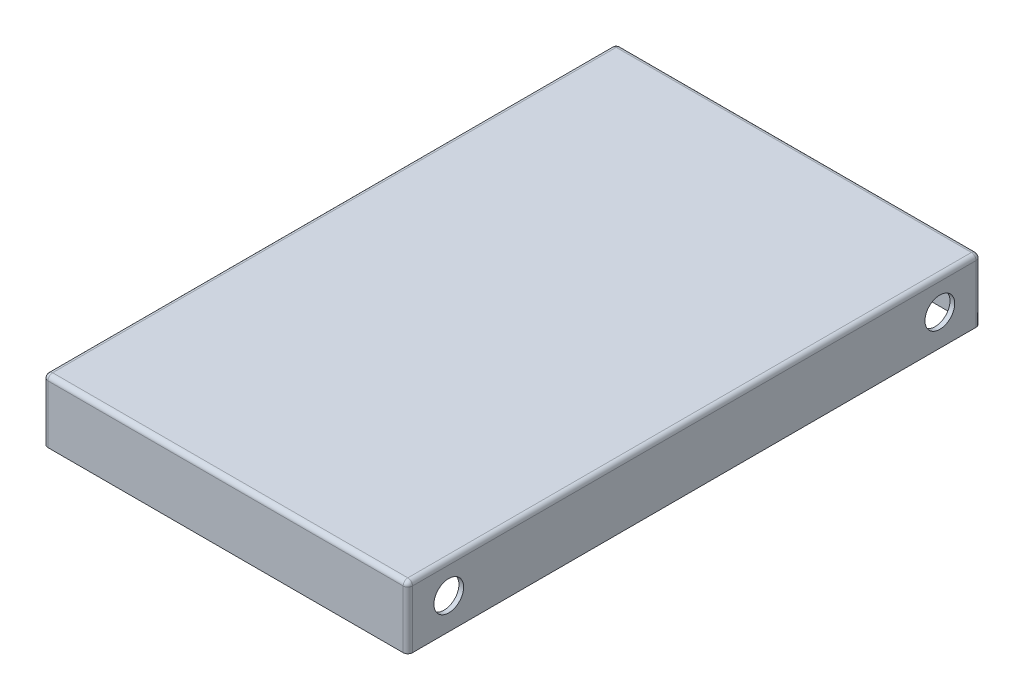
ISO-10303-21;
HEADER;
FILE_DESCRIPTION(('STEP AP214'),'2;1');
FILE_NAME('part.step','',(''),(''),'','','');
FILE_SCHEMA(('AUTOMOTIVE_DESIGN { 1 0 10303 214 1 1 1 1 }'));
ENDSEC;
DATA;
#1=APPLICATION_CONTEXT('core data for automotive mechanical design processes');
#2=APPLICATION_PROTOCOL_DEFINITION('international standard','automotive_design',2000,#1);
#3=PRODUCT_CONTEXT('',#1,'mechanical');
#4=PRODUCT('Part','Part','',(#3));
#5=PRODUCT_RELATED_PRODUCT_CATEGORY('part','',(#4));
#6=PRODUCT_DEFINITION_FORMATION('','',#4);
#7=PRODUCT_DEFINITION_CONTEXT('part definition',#1,'design');
#8=PRODUCT_DEFINITION('design','',#6,#7);
#9=PRODUCT_DEFINITION_SHAPE('','',#8);
#10=(LENGTH_UNIT() NAMED_UNIT(*) SI_UNIT(.MILLI.,.METRE.));
#11=(NAMED_UNIT(*) PLANE_ANGLE_UNIT() SI_UNIT($,.RADIAN.));
#12=(NAMED_UNIT(*) SI_UNIT($,.STERADIAN.) SOLID_ANGLE_UNIT());
#13=UNCERTAINTY_MEASURE_WITH_UNIT(LENGTH_MEASURE(1.E-05),#10,'distance_accuracy_value','');
#14=(GEOMETRIC_REPRESENTATION_CONTEXT(3) GLOBAL_UNCERTAINTY_ASSIGNED_CONTEXT((#13)) GLOBAL_UNIT_ASSIGNED_CONTEXT((#10,
#11,#12)) REPRESENTATION_CONTEXT('',''));
#15=CARTESIAN_POINT('',(0.,0.,0.));
#16=DIRECTION('',(0.,0.,1.));
#17=DIRECTION('',(1.,0.,0.));
#18=AXIS2_PLACEMENT_3D('',#15,#16,#17);
#19=CARTESIAN_POINT('',(-155.575,53.34,244.475));
#20=DIRECTION('',(1.,0.,0.));
#21=DIRECTION('',(0.,0.,-1.));
#22=AXIS2_PLACEMENT_3D('',#19,#20,#21);
#23=PLANE('',#22);
#24=CARTESIAN_POINT('',(-155.575,26.67,209.55));
#25=DIRECTION('',(1.,0.,0.));
#26=DIRECTION('',(0.,0.,-1.));
#27=AXIS2_PLACEMENT_3D('',#24,#25,#26);
#28=CIRCLE('',#27,12.6793894604822);
#29=CARTESIAN_POINT('',(-155.575,26.67,196.870610539518));
#30=VERTEX_POINT('',#29);
#31=EDGE_CURVE('E312',#30,#30,#28,.T.);
#32=ORIENTED_EDGE('',*,*,#31,.T.);
#33=EDGE_LOOP('',(#32));
#34=FACE_BOUND('',#33,.T.);
#35=CARTESIAN_POINT('',(-155.575,26.67,-209.55));
#36=DIRECTION('',(1.,0.,0.));
#37=DIRECTION('',(0.,0.,-1.));
#38=AXIS2_PLACEMENT_3D('',#35,#36,#37);
#39=CIRCLE('',#38,12.6793894604822);
#40=CARTESIAN_POINT('',(-155.575,26.67,-222.229389460482));
#41=VERTEX_POINT('',#40);
#42=EDGE_CURVE('E327',#41,#41,#39,.T.);
#43=ORIENTED_EDGE('',*,*,#42,.T.);
#44=EDGE_LOOP('',(#43));
#45=FACE_BOUND('',#44,.T.);
#46=DIRECTION('',(0.,0.,1.));
#47=VECTOR('',#46,1.);
#48=CARTESIAN_POINT('',(-155.575,49.34,-244.475));
#49=LINE('',#48,#47);
#50=CARTESIAN_POINT('',(-155.575,49.34,240.475));
#51=VERTEX_POINT('',#50);
#52=CARTESIAN_POINT('',(-155.575,49.34,-240.475));
#53=VERTEX_POINT('',#52);
#54=EDGE_CURVE('E67',#51,#53,#49,.F.);
#55=ORIENTED_EDGE('',*,*,#54,.T.);
#56=DIRECTION('',(0.,-1.,0.));
#57=VECTOR('',#56,1.);
#58=CARTESIAN_POINT('',(-155.575,53.34,-240.475));
#59=LINE('',#58,#57);
#60=CARTESIAN_POINT('',(-155.575,0.,-240.475));
#61=VERTEX_POINT('',#60);
#62=EDGE_CURVE('E262',#53,#61,#59,.T.);
#63=ORIENTED_EDGE('',*,*,#62,.T.);
#64=DIRECTION('',(0.,0.,1.));
#65=VECTOR('',#64,1.);
#66=CARTESIAN_POINT('',(-155.575,0.,244.475));
#67=LINE('',#66,#65);
#68=CARTESIAN_POINT('',(-155.575,0.,240.475));
#69=VERTEX_POINT('',#68);
#70=EDGE_CURVE('E205',#61,#69,#67,.T.);
#71=ORIENTED_EDGE('',*,*,#70,.T.);
#72=DIRECTION('',(0.,-1.,0.));
#73=VECTOR('',#72,1.);
#74=CARTESIAN_POINT('',(-155.575,53.34,240.475));
#75=LINE('',#74,#73);
#76=EDGE_CURVE('E258',#69,#51,#75,.F.);
#77=ORIENTED_EDGE('',*,*,#76,.T.);
#78=EDGE_LOOP('',(#55,#63,#71,#77));
#79=FACE_BOUND('',#78,.T.);
#80=ADVANCED_FACE('F39',(#34,#45,#79),#23,.F.);
#81=CARTESIAN_POINT('',(155.575,53.34,244.475));
#82=DIRECTION('',(0.,0.,-1.));
#83=DIRECTION('',(-1.,0.,0.));
#84=AXIS2_PLACEMENT_3D('',#81,#82,#83);
#85=PLANE('',#84);
#86=DIRECTION('',(1.,0.,0.));
#87=VECTOR('',#86,1.);
#88=CARTESIAN_POINT('',(-155.575,49.34,244.475));
#89=LINE('',#88,#87);
#90=CARTESIAN_POINT('',(151.575,49.34,244.475));
#91=VERTEX_POINT('',#90);
#92=CARTESIAN_POINT('',(-151.575,49.34,244.475));
#93=VERTEX_POINT('',#92);
#94=EDGE_CURVE('E253',#91,#93,#89,.F.);
#95=ORIENTED_EDGE('',*,*,#94,.T.);
#96=DIRECTION('',(0.,-1.,0.));
#97=VECTOR('',#96,1.);
#98=CARTESIAN_POINT('',(-151.575,53.34,244.475));
#99=LINE('',#98,#97);
#100=CARTESIAN_POINT('',(-151.575,0.,244.475));
#101=VERTEX_POINT('',#100);
#102=EDGE_CURVE('E255',#93,#101,#99,.T.);
#103=ORIENTED_EDGE('',*,*,#102,.T.);
#104=DIRECTION('',(1.,0.,0.));
#105=VECTOR('',#104,1.);
#106=CARTESIAN_POINT('',(155.575,0.,244.475));
#107=LINE('',#106,#105);
#108=CARTESIAN_POINT('',(151.575,0.,244.475));
#109=VERTEX_POINT('',#108);
#110=EDGE_CURVE('E209',#101,#109,#107,.T.);
#111=ORIENTED_EDGE('',*,*,#110,.T.);
#112=DIRECTION('',(0.,-1.,0.));
#113=VECTOR('',#112,1.);
#114=CARTESIAN_POINT('',(151.575,53.34,244.475));
#115=LINE('',#114,#113);
#116=EDGE_CURVE('E251',#109,#91,#115,.F.);
#117=ORIENTED_EDGE('',*,*,#116,.T.);
#118=EDGE_LOOP('',(#95,#103,#111,#117));
#119=FACE_BOUND('',#118,.T.);
#120=ADVANCED_FACE('F343',(#119),#85,.F.);
#121=CARTESIAN_POINT('',(155.575,53.34,244.475));
#122=DIRECTION('',(-1.,0.,0.));
#123=DIRECTION('',(0.,0.,1.));
#124=AXIS2_PLACEMENT_3D('',#121,#122,#123);
#125=PLANE('',#124);
#126=CARTESIAN_POINT('',(155.575,26.67,209.55));
#127=DIRECTION('',(1.,0.,0.));
#128=DIRECTION('',(0.,0.,-1.));
#129=AXIS2_PLACEMENT_3D('',#126,#127,#128);
#130=CIRCLE('',#129,12.6793894604822);
#131=CARTESIAN_POINT('',(155.575,26.67,196.870610539518));
#132=VERTEX_POINT('',#131);
#133=EDGE_CURVE('E320',#132,#132,#130,.T.);
#134=ORIENTED_EDGE('',*,*,#133,.F.);
#135=EDGE_LOOP('',(#134));
#136=FACE_BOUND('',#135,.T.);
#137=CARTESIAN_POINT('',(155.575,26.67,-209.55));
#138=DIRECTION('',(1.,0.,0.));
#139=DIRECTION('',(0.,0.,-1.));
#140=AXIS2_PLACEMENT_3D('',#137,#138,#139);
#141=CIRCLE('',#140,12.6793894604822);
#142=CARTESIAN_POINT('',(155.575,26.67,-222.229389460482));
#143=VERTEX_POINT('',#142);
#144=EDGE_CURVE('E333',#143,#143,#141,.T.);
#145=ORIENTED_EDGE('',*,*,#144,.F.);
#146=EDGE_LOOP('',(#145));
#147=FACE_BOUND('',#146,.T.);
#148=DIRECTION('',(0.,0.,-1.));
#149=VECTOR('',#148,1.);
#150=CARTESIAN_POINT('',(155.575,0.,244.475));
#151=LINE('',#150,#149);
#152=CARTESIAN_POINT('',(155.575,0.,240.475));
#153=VERTEX_POINT('',#152);
#154=CARTESIAN_POINT('',(155.575,0.,-240.475));
#155=VERTEX_POINT('',#154);
#156=EDGE_CURVE('E214',#153,#155,#151,.T.);
#157=ORIENTED_EDGE('',*,*,#156,.T.);
#158=DIRECTION('',(0.,-1.,0.));
#159=VECTOR('',#158,1.);
#160=CARTESIAN_POINT('',(155.575,53.34,-240.475));
#161=LINE('',#160,#159);
#162=CARTESIAN_POINT('',(155.575,49.34,-240.475));
#163=VERTEX_POINT('',#162);
#164=EDGE_CURVE('E248',#155,#163,#161,.F.);
#165=ORIENTED_EDGE('',*,*,#164,.T.);
#166=DIRECTION('',(0.,0.,-1.));
#167=VECTOR('',#166,1.);
#168=CARTESIAN_POINT('',(155.575,49.34,244.475));
#169=LINE('',#168,#167);
#170=CARTESIAN_POINT('',(155.575,49.34,240.475));
#171=VERTEX_POINT('',#170);
#172=EDGE_CURVE('E245',#163,#171,#169,.F.);
#173=ORIENTED_EDGE('',*,*,#172,.T.);
#174=DIRECTION('',(0.,-1.,0.));
#175=VECTOR('',#174,1.);
#176=CARTESIAN_POINT('',(155.575,53.34,240.475));
#177=LINE('',#176,#175);
#178=EDGE_CURVE('E243',#171,#153,#177,.T.);
#179=ORIENTED_EDGE('',*,*,#178,.T.);
#180=EDGE_LOOP('',(#157,#165,#173,#179));
#181=FACE_BOUND('',#180,.T.);
#182=ADVANCED_FACE('F339',(#136,#147,#181),#125,.F.);
#183=CARTESIAN_POINT('',(155.575,53.34,-244.475));
#184=DIRECTION('',(0.,0.,1.));
#185=DIRECTION('',(1.,0.,0.));
#186=AXIS2_PLACEMENT_3D('',#183,#184,#185);
#187=PLANE('',#186);
#188=DIRECTION('',(-1.,0.,0.));
#189=VECTOR('',#188,1.);
#190=CARTESIAN_POINT('',(155.575,0.,-244.475));
#191=LINE('',#190,#189);
#192=CARTESIAN_POINT('',(151.575,0.,-244.475));
#193=VERTEX_POINT('',#192);
#194=CARTESIAN_POINT('',(-151.575,0.,-244.475));
#195=VERTEX_POINT('',#194);
#196=EDGE_CURVE('E218',#193,#195,#191,.T.);
#197=ORIENTED_EDGE('',*,*,#196,.T.);
#198=DIRECTION('',(0.,-1.,0.));
#199=VECTOR('',#198,1.);
#200=CARTESIAN_POINT('',(-151.575,53.34,-244.475));
#201=LINE('',#200,#199);
#202=CARTESIAN_POINT('',(-151.575,49.34,-244.475));
#203=VERTEX_POINT('',#202);
#204=EDGE_CURVE('E240',#195,#203,#201,.F.);
#205=ORIENTED_EDGE('',*,*,#204,.T.);
#206=DIRECTION('',(-1.,0.,0.));
#207=VECTOR('',#206,1.);
#208=CARTESIAN_POINT('',(155.575,49.34,-244.475));
#209=LINE('',#208,#207);
#210=CARTESIAN_POINT('',(151.575,49.34,-244.475));
#211=VERTEX_POINT('',#210);
#212=EDGE_CURVE('E236',#203,#211,#209,.F.);
#213=ORIENTED_EDGE('',*,*,#212,.T.);
#214=DIRECTION('',(0.,-1.,0.));
#215=VECTOR('',#214,1.);
#216=CARTESIAN_POINT('',(151.575,53.34,-244.475));
#217=LINE('',#216,#215);
#218=EDGE_CURVE('E233',#211,#193,#217,.T.);
#219=ORIENTED_EDGE('',*,*,#218,.T.);
#220=EDGE_LOOP('',(#197,#205,#213,#219));
#221=FACE_BOUND('',#220,.T.);
#222=ADVANCED_FACE('F342',(#221),#187,.F.);
#223=CARTESIAN_POINT('',(0.,53.34,0.));
#224=DIRECTION('',(0.,1.,0.));
#225=DIRECTION('',(0.,0.,1.));
#226=AXIS2_PLACEMENT_3D('',#223,#224,#225);
#227=PLANE('',#226);
#228=DIRECTION('',(0.,0.,-1.));
#229=VECTOR('',#228,1.);
#230=CARTESIAN_POINT('',(151.575,53.34,-244.475));
#231=LINE('',#230,#229);
#232=CARTESIAN_POINT('',(151.575,53.34,240.475));
#233=VERTEX_POINT('',#232);
#234=CARTESIAN_POINT('',(151.575,53.34,-240.475));
#235=VERTEX_POINT('',#234);
#236=EDGE_CURVE('E226',#233,#235,#231,.T.);
#237=ORIENTED_EDGE('',*,*,#236,.T.);
#238=DIRECTION('',(-1.,0.,0.));
#239=VECTOR('',#238,1.);
#240=CARTESIAN_POINT('',(-155.575,53.34,-240.475));
#241=LINE('',#240,#239);
#242=CARTESIAN_POINT('',(-151.575,53.34,-240.475));
#243=VERTEX_POINT('',#242);
#244=EDGE_CURVE('E229',#235,#243,#241,.T.);
#245=ORIENTED_EDGE('',*,*,#244,.T.);
#246=DIRECTION('',(0.,0.,1.));
#247=VECTOR('',#246,1.);
#248=CARTESIAN_POINT('',(-151.575,53.34,244.475));
#249=LINE('',#248,#247);
#250=CARTESIAN_POINT('',(-151.575,53.34,240.475));
#251=VERTEX_POINT('',#250);
#252=EDGE_CURVE('E222',#243,#251,#249,.T.);
#253=ORIENTED_EDGE('',*,*,#252,.T.);
#254=DIRECTION('',(1.,0.,0.));
#255=VECTOR('',#254,1.);
#256=CARTESIAN_POINT('',(155.575,53.34,240.475));
#257=LINE('',#256,#255);
#258=EDGE_CURVE('E224',#251,#233,#257,.T.);
#259=ORIENTED_EDGE('',*,*,#258,.T.);
#260=EDGE_LOOP('',(#237,#245,#253,#259));
#261=FACE_BOUND('',#260,.T.);
#262=ADVANCED_FACE('F406',(#261),#227,.T.);
#263=CARTESIAN_POINT('',(0.,0.,0.));
#264=DIRECTION('',(0.,1.,0.));
#265=DIRECTION('',(0.,0.,1.));
#266=AXIS2_PLACEMENT_3D('',#263,#264,#265);
#267=PLANE('',#266);
#268=DIRECTION('',(-1.,0.,0.));
#269=VECTOR('',#268,1.);
#270=CARTESIAN_POINT('',(155.575,0.,-240.475));
#271=LINE('',#270,#269);
#272=CARTESIAN_POINT('',(151.575,0.,-240.475));
#273=VERTEX_POINT('',#272);
#274=CARTESIAN_POINT('',(-151.575,0.,-240.475));
#275=VERTEX_POINT('',#274);
#276=EDGE_CURVE('E179',#273,#275,#271,.T.);
#277=ORIENTED_EDGE('',*,*,#276,.T.);
#278=DIRECTION('',(0.,0.,1.));
#279=VECTOR('',#278,1.);
#280=CARTESIAN_POINT('',(-151.575,0.,244.475));
#281=LINE('',#280,#279);
#282=CARTESIAN_POINT('',(-151.575,0.,240.475));
#283=VERTEX_POINT('',#282);
#284=EDGE_CURVE('E158',#275,#283,#281,.T.);
#285=ORIENTED_EDGE('',*,*,#284,.T.);
#286=DIRECTION('',(1.,0.,0.));
#287=VECTOR('',#286,1.);
#288=CARTESIAN_POINT('',(155.575,0.,240.475));
#289=LINE('',#288,#287);
#290=CARTESIAN_POINT('',(151.575,0.,240.475));
#291=VERTEX_POINT('',#290);
#292=EDGE_CURVE('E199',#283,#291,#289,.T.);
#293=ORIENTED_EDGE('',*,*,#292,.T.);
#294=DIRECTION('',(0.,0.,-1.));
#295=VECTOR('',#294,1.);
#296=CARTESIAN_POINT('',(151.575,0.,244.475));
#297=LINE('',#296,#295);
#298=EDGE_CURVE('E56',#291,#273,#297,.T.);
#299=ORIENTED_EDGE('',*,*,#298,.T.);
#300=EDGE_LOOP('',(#277,#285,#293,#299));
#301=FACE_BOUND('',#300,.T.);
#302=ORIENTED_EDGE('',*,*,#70,.F.);
#303=CARTESIAN_POINT('',(-151.575,0.,-240.475));
#304=DIRECTION('',(0.,1.,0.));
#305=DIRECTION('',(0.,0.,1.));
#306=AXIS2_PLACEMENT_3D('',#303,#304,#305);
#307=CIRCLE('',#306,4.);
#308=EDGE_CURVE('E11',#61,#195,#307,.F.);
#309=ORIENTED_EDGE('',*,*,#308,.T.);
#310=ORIENTED_EDGE('',*,*,#196,.F.);
#311=CARTESIAN_POINT('',(151.575,0.,-240.475));
#312=DIRECTION('',(0.,1.,0.));
#313=DIRECTION('',(0.,0.,1.));
#314=AXIS2_PLACEMENT_3D('',#311,#312,#313);
#315=CIRCLE('',#314,4.);
#316=EDGE_CURVE('E48',#193,#155,#315,.F.);
#317=ORIENTED_EDGE('',*,*,#316,.T.);
#318=ORIENTED_EDGE('',*,*,#156,.F.);
#319=CARTESIAN_POINT('',(151.575,0.,240.475));
#320=DIRECTION('',(0.,1.,0.));
#321=DIRECTION('',(0.,0.,1.));
#322=AXIS2_PLACEMENT_3D('',#319,#320,#321);
#323=CIRCLE('',#322,4.);
#324=EDGE_CURVE('E265',#153,#109,#323,.F.);
#325=ORIENTED_EDGE('',*,*,#324,.T.);
#326=ORIENTED_EDGE('',*,*,#110,.F.);
#327=CARTESIAN_POINT('',(-151.575,0.,240.475));
#328=DIRECTION('',(0.,1.,0.));
#329=DIRECTION('',(0.,0.,1.));
#330=AXIS2_PLACEMENT_3D('',#327,#328,#329);
#331=CIRCLE('',#330,4.);
#332=EDGE_CURVE('E267',#101,#69,#331,.F.);
#333=ORIENTED_EDGE('',*,*,#332,.T.);
#334=EDGE_LOOP('',(#302,#309,#310,#317,#318,#325,#326,#333));
#335=FACE_BOUND('',#334,.T.);
#336=ADVANCED_FACE('F387',(#301,#335),#267,.F.);
#337=CARTESIAN_POINT('',(151.575,53.34,240.475));
#338=DIRECTION('',(0.,-1.,0.));
#339=DIRECTION('',(0.,0.,-1.));
#340=AXIS2_PLACEMENT_3D('',#337,#338,#339);
#341=CYLINDRICAL_SURFACE('',#340,4.);
#342=ORIENTED_EDGE('',*,*,#324,.F.);
#343=ORIENTED_EDGE('',*,*,#178,.F.);
#344=CARTESIAN_POINT('',(151.575,49.34,240.475));
#345=DIRECTION('',(0.,1.,0.));
#346=DIRECTION('',(0.,0.,1.));
#347=AXIS2_PLACEMENT_3D('',#344,#345,#346);
#348=CIRCLE('',#347,4.);
#349=EDGE_CURVE('E210',#91,#171,#348,.T.);
#350=ORIENTED_EDGE('',*,*,#349,.F.);
#351=ORIENTED_EDGE('',*,*,#116,.F.);
#352=EDGE_LOOP('',(#342,#343,#350,#351));
#353=FACE_BOUND('',#352,.T.);
#354=ADVANCED_FACE('F41',(#353),#341,.T.);
#355=CARTESIAN_POINT('',(0.,49.34,240.475));
#356=DIRECTION('',(-1.,0.,0.));
#357=DIRECTION('',(0.,0.,1.));
#358=AXIS2_PLACEMENT_3D('',#355,#356,#357);
#359=CYLINDRICAL_SURFACE('',#358,4.);
#360=CARTESIAN_POINT('',(-151.575,49.34,240.475));
#361=DIRECTION('',(-1.,0.,0.));
#362=DIRECTION('',(0.,0.,1.));
#363=AXIS2_PLACEMENT_3D('',#360,#361,#362);
#364=CIRCLE('',#363,4.);
#365=EDGE_CURVE('E301',#93,#251,#364,.T.);
#366=ORIENTED_EDGE('',*,*,#365,.F.);
#367=ORIENTED_EDGE('',*,*,#94,.F.);
#368=CARTESIAN_POINT('',(151.575,49.34,240.475));
#369=DIRECTION('',(1.,0.,0.));
#370=DIRECTION('',(0.,0.,-1.));
#371=AXIS2_PLACEMENT_3D('',#368,#369,#370);
#372=CIRCLE('',#371,4.);
#373=EDGE_CURVE('E304',#233,#91,#372,.T.);
#374=ORIENTED_EDGE('',*,*,#373,.F.);
#375=ORIENTED_EDGE('',*,*,#258,.F.);
#376=EDGE_LOOP('',(#366,#367,#374,#375));
#377=FACE_BOUND('',#376,.T.);
#378=ADVANCED_FACE('F376',(#377),#359,.T.);
#379=CARTESIAN_POINT('',(-151.575,53.34,240.475));
#380=DIRECTION('',(0.,-1.,0.));
#381=DIRECTION('',(0.,0.,-1.));
#382=AXIS2_PLACEMENT_3D('',#379,#380,#381);
#383=CYLINDRICAL_SURFACE('',#382,4.);
#384=ORIENTED_EDGE('',*,*,#332,.F.);
#385=ORIENTED_EDGE('',*,*,#102,.F.);
#386=CARTESIAN_POINT('',(-151.575,49.34,240.475));
#387=DIRECTION('',(0.,1.,0.));
#388=DIRECTION('',(0.,0.,1.));
#389=AXIS2_PLACEMENT_3D('',#386,#387,#388);
#390=CIRCLE('',#389,4.);
#391=EDGE_CURVE('E298',#51,#93,#390,.T.);
#392=ORIENTED_EDGE('',*,*,#391,.F.);
#393=ORIENTED_EDGE('',*,*,#76,.F.);
#394=EDGE_LOOP('',(#384,#385,#392,#393));
#395=FACE_BOUND('',#394,.T.);
#396=ADVANCED_FACE('F383',(#395),#383,.T.);
#397=CARTESIAN_POINT('',(151.575,49.34,240.475));
#398=DIRECTION('',(0.,0.,1.));
#399=DIRECTION('',(1.,0.,0.));
#400=AXIS2_PLACEMENT_3D('',#397,#398,#399);
#401=SPHERICAL_SURFACE('',#400,4.);
#402=ORIENTED_EDGE('',*,*,#373,.T.);
#403=ORIENTED_EDGE('',*,*,#349,.T.);
#404=CARTESIAN_POINT('',(151.575,49.34,240.475));
#405=DIRECTION('',(0.,0.,1.));
#406=DIRECTION('',(1.,0.,0.));
#407=AXIS2_PLACEMENT_3D('',#404,#405,#406);
#408=CIRCLE('',#407,4.);
#409=EDGE_CURVE('E295',#233,#171,#408,.F.);
#410=ORIENTED_EDGE('',*,*,#409,.F.);
#411=EDGE_LOOP('',(#402,#403,#410));
#412=FACE_BOUND('',#411,.T.);
#413=ADVANCED_FACE('F370',(#412),#401,.T.);
#414=CARTESIAN_POINT('',(-151.575,49.34,240.475));
#415=DIRECTION('',(0.,0.,1.));
#416=DIRECTION('',(1.,0.,0.));
#417=AXIS2_PLACEMENT_3D('',#414,#415,#416);
#418=SPHERICAL_SURFACE('',#417,4.);
#419=ORIENTED_EDGE('',*,*,#391,.T.);
#420=ORIENTED_EDGE('',*,*,#365,.T.);
#421=CARTESIAN_POINT('',(-151.575,49.34,240.475));
#422=DIRECTION('',(0.,0.,1.));
#423=DIRECTION('',(1.,0.,0.));
#424=AXIS2_PLACEMENT_3D('',#421,#422,#423);
#425=CIRCLE('',#424,4.);
#426=EDGE_CURVE('E292',#51,#251,#425,.F.);
#427=ORIENTED_EDGE('',*,*,#426,.F.);
#428=EDGE_LOOP('',(#419,#420,#427));
#429=FACE_BOUND('',#428,.T.);
#430=ADVANCED_FACE('F436',(#429),#418,.T.);
#431=CARTESIAN_POINT('',(151.575,53.34,-240.475));
#432=DIRECTION('',(0.,-1.,0.));
#433=DIRECTION('',(0.,0.,-1.));
#434=AXIS2_PLACEMENT_3D('',#431,#432,#433);
#435=CYLINDRICAL_SURFACE('',#434,4.);
#436=ORIENTED_EDGE('',*,*,#316,.F.);
#437=ORIENTED_EDGE('',*,*,#218,.F.);
#438=CARTESIAN_POINT('',(151.575,49.34,-240.475));
#439=DIRECTION('',(0.,1.,0.));
#440=DIRECTION('',(0.,0.,1.));
#441=AXIS2_PLACEMENT_3D('',#438,#439,#440);
#442=CIRCLE('',#441,4.);
#443=EDGE_CURVE('E288',#163,#211,#442,.T.);
#444=ORIENTED_EDGE('',*,*,#443,.F.);
#445=ORIENTED_EDGE('',*,*,#164,.F.);
#446=EDGE_LOOP('',(#436,#437,#444,#445));
#447=FACE_BOUND('',#446,.T.);
#448=ADVANCED_FACE('F355',(#447),#435,.T.);
#449=CARTESIAN_POINT('',(151.575,49.34,0.));
#450=DIRECTION('',(0.,0.,1.));
#451=DIRECTION('',(1.,0.,0.));
#452=AXIS2_PLACEMENT_3D('',#449,#450,#451);
#453=CYLINDRICAL_SURFACE('',#452,4.);
#454=ORIENTED_EDGE('',*,*,#409,.T.);
#455=ORIENTED_EDGE('',*,*,#172,.F.);
#456=CARTESIAN_POINT('',(151.575,49.34,-240.475));
#457=DIRECTION('',(0.,0.,-1.));
#458=DIRECTION('',(-1.,0.,0.));
#459=AXIS2_PLACEMENT_3D('',#456,#457,#458);
#460=CIRCLE('',#459,4.);
#461=EDGE_CURVE('E284',#235,#163,#460,.T.);
#462=ORIENTED_EDGE('',*,*,#461,.F.);
#463=ORIENTED_EDGE('',*,*,#236,.F.);
#464=EDGE_LOOP('',(#454,#455,#462,#463));
#465=FACE_BOUND('',#464,.T.);
#466=ADVANCED_FACE('F364',(#465),#453,.T.);
#467=CARTESIAN_POINT('',(-151.575,49.34,0.));
#468=DIRECTION('',(0.,0.,-1.));
#469=DIRECTION('',(-1.,0.,0.));
#470=AXIS2_PLACEMENT_3D('',#467,#468,#469);
#471=CYLINDRICAL_SURFACE('',#470,4.);
#472=ORIENTED_EDGE('',*,*,#426,.T.);
#473=ORIENTED_EDGE('',*,*,#252,.F.);
#474=CARTESIAN_POINT('',(-151.575,49.34,-240.475));
#475=DIRECTION('',(0.,0.,-1.));
#476=DIRECTION('',(-1.,0.,0.));
#477=AXIS2_PLACEMENT_3D('',#474,#475,#476);
#478=CIRCLE('',#477,4.);
#479=EDGE_CURVE('E280',#53,#243,#478,.T.);
#480=ORIENTED_EDGE('',*,*,#479,.F.);
#481=ORIENTED_EDGE('',*,*,#54,.F.);
#482=EDGE_LOOP('',(#472,#473,#480,#481));
#483=FACE_BOUND('',#482,.T.);
#484=ADVANCED_FACE('F397',(#483),#471,.T.);
#485=CARTESIAN_POINT('',(-151.575,53.34,-240.475));
#486=DIRECTION('',(0.,-1.,0.));
#487=DIRECTION('',(0.,0.,-1.));
#488=AXIS2_PLACEMENT_3D('',#485,#486,#487);
#489=CYLINDRICAL_SURFACE('',#488,4.);
#490=ORIENTED_EDGE('',*,*,#308,.F.);
#491=ORIENTED_EDGE('',*,*,#62,.F.);
#492=CARTESIAN_POINT('',(-151.575,49.34,-240.475));
#493=DIRECTION('',(0.,1.,0.));
#494=DIRECTION('',(0.,0.,1.));
#495=AXIS2_PLACEMENT_3D('',#492,#493,#494);
#496=CIRCLE('',#495,4.);
#497=EDGE_CURVE('E276',#203,#53,#496,.T.);
#498=ORIENTED_EDGE('',*,*,#497,.F.);
#499=ORIENTED_EDGE('',*,*,#204,.F.);
#500=EDGE_LOOP('',(#490,#491,#498,#499));
#501=FACE_BOUND('',#500,.T.);
#502=ADVANCED_FACE('F392',(#501),#489,.T.);
#503=CARTESIAN_POINT('',(151.575,49.34,-240.475));
#504=DIRECTION('',(1.,0.,0.));
#505=DIRECTION('',(0.,0.,-1.));
#506=AXIS2_PLACEMENT_3D('',#503,#504,#505);
#507=SPHERICAL_SURFACE('',#506,4.);
#508=ORIENTED_EDGE('',*,*,#461,.T.);
#509=ORIENTED_EDGE('',*,*,#443,.T.);
#510=CARTESIAN_POINT('',(151.575,49.34,-240.475));
#511=DIRECTION('',(1.,0.,0.));
#512=DIRECTION('',(0.,0.,-1.));
#513=AXIS2_PLACEMENT_3D('',#510,#511,#512);
#514=CIRCLE('',#513,4.);
#515=EDGE_CURVE('E273',#235,#211,#514,.F.);
#516=ORIENTED_EDGE('',*,*,#515,.F.);
#517=EDGE_LOOP('',(#508,#509,#516));
#518=FACE_BOUND('',#517,.T.);
#519=ADVANCED_FACE('F360',(#518),#507,.T.);
#520=CARTESIAN_POINT('',(-151.575,49.34,-240.475));
#521=DIRECTION('',(-1.,0.,0.));
#522=DIRECTION('',(0.,0.,1.));
#523=AXIS2_PLACEMENT_3D('',#520,#521,#522);
#524=SPHERICAL_SURFACE('',#523,4.);
#525=ORIENTED_EDGE('',*,*,#497,.T.);
#526=ORIENTED_EDGE('',*,*,#479,.T.);
#527=CARTESIAN_POINT('',(-151.575,49.34,-240.475));
#528=DIRECTION('',(-1.,0.,0.));
#529=DIRECTION('',(0.,0.,1.));
#530=AXIS2_PLACEMENT_3D('',#527,#528,#529);
#531=CIRCLE('',#530,4.);
#532=EDGE_CURVE('E163',#203,#243,#531,.F.);
#533=ORIENTED_EDGE('',*,*,#532,.F.);
#534=EDGE_LOOP('',(#525,#526,#533));
#535=FACE_BOUND('',#534,.T.);
#536=ADVANCED_FACE('F400',(#535),#524,.T.);
#537=CARTESIAN_POINT('',(0.,49.34,-240.475));
#538=DIRECTION('',(1.,0.,0.));
#539=DIRECTION('',(0.,0.,-1.));
#540=AXIS2_PLACEMENT_3D('',#537,#538,#539);
#541=CYLINDRICAL_SURFACE('',#540,4.);
#542=ORIENTED_EDGE('',*,*,#515,.T.);
#543=ORIENTED_EDGE('',*,*,#212,.F.);
#544=ORIENTED_EDGE('',*,*,#532,.T.);
#545=ORIENTED_EDGE('',*,*,#244,.F.);
#546=EDGE_LOOP('',(#542,#543,#544,#545));
#547=FACE_BOUND('',#546,.T.);
#548=ADVANCED_FACE('F402',(#547),#541,.T.);
#549=CARTESIAN_POINT('',(-151.575,53.34,244.475));
#550=DIRECTION('',(1.,0.,0.));
#551=DIRECTION('',(0.,0.,-1.));
#552=AXIS2_PLACEMENT_3D('',#549,#550,#551);
#553=PLANE('',#552);
#554=CARTESIAN_POINT('',(-151.575,26.67,209.55));
#555=DIRECTION('',(1.,0.,0.));
#556=DIRECTION('',(0.,0.,-1.));
#557=AXIS2_PLACEMENT_3D('',#554,#555,#556);
#558=CIRCLE('',#557,12.6793894604822);
#559=CARTESIAN_POINT('',(-151.575,26.67,196.870610539518));
#560=VERTEX_POINT('',#559);
#561=EDGE_CURVE('E188',#560,#560,#558,.T.);
#562=ORIENTED_EDGE('',*,*,#561,.F.);
#563=EDGE_LOOP('',(#562));
#564=FACE_BOUND('',#563,.T.);
#565=CARTESIAN_POINT('',(-151.575,26.67,-209.55));
#566=DIRECTION('',(1.,0.,0.));
#567=DIRECTION('',(0.,0.,-1.));
#568=AXIS2_PLACEMENT_3D('',#565,#566,#567);
#569=CIRCLE('',#568,12.6793894604822);
#570=CARTESIAN_POINT('',(-151.575,26.67,-222.229389460482));
#571=VERTEX_POINT('',#570);
#572=EDGE_CURVE('E311',#571,#571,#569,.T.);
#573=ORIENTED_EDGE('',*,*,#572,.F.);
#574=EDGE_LOOP('',(#573));
#575=FACE_BOUND('',#574,.T.);
#576=DIRECTION('',(0.,0.,1.));
#577=VECTOR('',#576,1.);
#578=CARTESIAN_POINT('',(-151.575,49.34,244.475));
#579=LINE('',#578,#577);
#580=CARTESIAN_POINT('',(-151.575,49.34,-240.475));
#581=VERTEX_POINT('',#580);
#582=CARTESIAN_POINT('',(-151.575,49.34,240.475));
#583=VERTEX_POINT('',#582);
#584=EDGE_CURVE('E155',#581,#583,#579,.T.);
#585=ORIENTED_EDGE('',*,*,#584,.T.);
#586=DIRECTION('',(0.,-1.,0.));
#587=VECTOR('',#586,1.);
#588=CARTESIAN_POINT('',(-151.575,53.34,240.475));
#589=LINE('',#588,#587);
#590=EDGE_CURVE('E164',#583,#283,#589,.T.);
#591=ORIENTED_EDGE('',*,*,#590,.T.);
#592=ORIENTED_EDGE('',*,*,#284,.F.);
#593=DIRECTION('',(0.,-1.,0.));
#594=VECTOR('',#593,1.);
#595=CARTESIAN_POINT('',(-151.575,53.34,-240.475));
#596=LINE('',#595,#594);
#597=EDGE_CURVE('E151',#581,#275,#596,.T.);
#598=ORIENTED_EDGE('',*,*,#597,.F.);
#599=EDGE_LOOP('',(#585,#591,#592,#598));
#600=FACE_BOUND('',#599,.T.);
#601=ADVANCED_FACE('F153',(#564,#575,#600),#553,.T.);
#602=CARTESIAN_POINT('',(155.575,53.34,240.475));
#603=DIRECTION('',(0.,0.,-1.));
#604=DIRECTION('',(-1.,0.,0.));
#605=AXIS2_PLACEMENT_3D('',#602,#603,#604);
#606=PLANE('',#605);
#607=DIRECTION('',(-1.,0.,0.));
#608=VECTOR('',#607,1.);
#609=CARTESIAN_POINT('',(0.,49.34,240.475));
#610=LINE('',#609,#608);
#611=CARTESIAN_POINT('',(151.575,49.34,240.475));
#612=VERTEX_POINT('',#611);
#613=EDGE_CURVE('E177',#612,#583,#610,.T.);
#614=ORIENTED_EDGE('',*,*,#613,.F.);
#615=DIRECTION('',(0.,-1.,0.));
#616=VECTOR('',#615,1.);
#617=CARTESIAN_POINT('',(151.575,53.34,240.475));
#618=LINE('',#617,#616);
#619=EDGE_CURVE('E174',#612,#291,#618,.T.);
#620=ORIENTED_EDGE('',*,*,#619,.T.);
#621=ORIENTED_EDGE('',*,*,#292,.F.);
#622=ORIENTED_EDGE('',*,*,#590,.F.);
#623=EDGE_LOOP('',(#614,#620,#621,#622));
#624=FACE_BOUND('',#623,.T.);
#625=ADVANCED_FACE('F461',(#624),#606,.T.);
#626=CARTESIAN_POINT('',(151.575,53.34,244.475));
#627=DIRECTION('',(-1.,0.,0.));
#628=DIRECTION('',(0.,0.,1.));
#629=AXIS2_PLACEMENT_3D('',#626,#627,#628);
#630=PLANE('',#629);
#631=CARTESIAN_POINT('',(151.575,26.67,209.55));
#632=DIRECTION('',(-1.,0.,0.));
#633=DIRECTION('',(0.,0.,1.));
#634=AXIS2_PLACEMENT_3D('',#631,#632,#633);
#635=CIRCLE('',#634,12.6793894604822);
#636=CARTESIAN_POINT('',(151.575,26.67,222.229389460482));
#637=VERTEX_POINT('',#636);
#638=EDGE_CURVE('E43',#637,#637,#635,.T.);
#639=ORIENTED_EDGE('',*,*,#638,.F.);
#640=EDGE_LOOP('',(#639));
#641=FACE_BOUND('',#640,.T.);
#642=CARTESIAN_POINT('',(151.575,26.67,-209.55));
#643=DIRECTION('',(-1.,0.,0.));
#644=DIRECTION('',(0.,0.,1.));
#645=AXIS2_PLACEMENT_3D('',#642,#643,#644);
#646=CIRCLE('',#645,12.6793894604822);
#647=CARTESIAN_POINT('',(151.575,26.67,-196.870610539518));
#648=VERTEX_POINT('',#647);
#649=EDGE_CURVE('E308',#648,#648,#646,.T.);
#650=ORIENTED_EDGE('',*,*,#649,.F.);
#651=EDGE_LOOP('',(#650));
#652=FACE_BOUND('',#651,.T.);
#653=ORIENTED_EDGE('',*,*,#298,.F.);
#654=ORIENTED_EDGE('',*,*,#619,.F.);
#655=DIRECTION('',(0.,0.,1.));
#656=VECTOR('',#655,1.);
#657=CARTESIAN_POINT('',(151.575,49.34,0.));
#658=LINE('',#657,#656);
#659=CARTESIAN_POINT('',(151.575,49.34,-240.475));
#660=VERTEX_POINT('',#659);
#661=EDGE_CURVE('E194',#660,#612,#658,.T.);
#662=ORIENTED_EDGE('',*,*,#661,.F.);
#663=DIRECTION('',(0.,-1.,0.));
#664=VECTOR('',#663,1.);
#665=CARTESIAN_POINT('',(151.575,53.34,-240.475));
#666=LINE('',#665,#664);
#667=EDGE_CURVE('E170',#660,#273,#666,.T.);
#668=ORIENTED_EDGE('',*,*,#667,.T.);
#669=EDGE_LOOP('',(#653,#654,#662,#668));
#670=FACE_BOUND('',#669,.T.);
#671=ADVANCED_FACE('F458',(#641,#652,#670),#630,.T.);
#672=CARTESIAN_POINT('',(155.575,53.34,-240.475));
#673=DIRECTION('',(0.,0.,1.));
#674=DIRECTION('',(1.,0.,0.));
#675=AXIS2_PLACEMENT_3D('',#672,#673,#674);
#676=PLANE('',#675);
#677=ORIENTED_EDGE('',*,*,#276,.F.);
#678=ORIENTED_EDGE('',*,*,#667,.F.);
#679=DIRECTION('',(1.,0.,0.));
#680=VECTOR('',#679,1.);
#681=CARTESIAN_POINT('',(0.,49.34,-240.475));
#682=LINE('',#681,#680);
#683=EDGE_CURVE('E168',#581,#660,#682,.T.);
#684=ORIENTED_EDGE('',*,*,#683,.F.);
#685=ORIENTED_EDGE('',*,*,#597,.T.);
#686=EDGE_LOOP('',(#677,#678,#684,#685));
#687=FACE_BOUND('',#686,.T.);
#688=ADVANCED_FACE('F169',(#687),#676,.T.);
#689=CARTESIAN_POINT('',(0.,49.34,0.));
#690=DIRECTION('',(0.,1.,0.));
#691=DIRECTION('',(0.,0.,1.));
#692=AXIS2_PLACEMENT_3D('',#689,#690,#691);
#693=PLANE('',#692);
#694=ORIENTED_EDGE('',*,*,#661,.T.);
#695=ORIENTED_EDGE('',*,*,#613,.T.);
#696=ORIENTED_EDGE('',*,*,#584,.F.);
#697=ORIENTED_EDGE('',*,*,#683,.T.);
#698=EDGE_LOOP('',(#694,#695,#696,#697));
#699=FACE_BOUND('',#698,.T.);
#700=ADVANCED_FACE('F176',(#699),#693,.F.);
#701=CARTESIAN_POINT('',(-155.575,26.67,-209.55));
#702=DIRECTION('',(1.,0.,0.));
#703=DIRECTION('',(0.,0.,-1.));
#704=AXIS2_PLACEMENT_3D('',#701,#702,#703);
#705=CYLINDRICAL_SURFACE('',#704,12.6793894604822);
#706=ORIENTED_EDGE('',*,*,#649,.T.);
#707=EDGE_LOOP('',(#706));
#708=FACE_BOUND('',#707,.T.);
#709=ORIENTED_EDGE('',*,*,#144,.T.);
#710=EDGE_LOOP('',(#709));
#711=FACE_BOUND('',#710,.T.);
#712=ADVANCED_FACE('F337',(#708,#711),#705,.F.);
#713=CARTESIAN_POINT('',(-155.575,26.67,209.55));
#714=DIRECTION('',(1.,0.,0.));
#715=DIRECTION('',(0.,0.,-1.));
#716=AXIS2_PLACEMENT_3D('',#713,#714,#715);
#717=CYLINDRICAL_SURFACE('',#716,12.6793894604822);
#718=ORIENTED_EDGE('',*,*,#638,.T.);
#719=EDGE_LOOP('',(#718));
#720=FACE_BOUND('',#719,.T.);
#721=ORIENTED_EDGE('',*,*,#133,.T.);
#722=EDGE_LOOP('',(#721));
#723=FACE_BOUND('',#722,.T.);
#724=ADVANCED_FACE('F471',(#720,#723),#717,.F.);
#725=ORIENTED_EDGE('',*,*,#572,.T.);
#726=EDGE_LOOP('',(#725));
#727=FACE_BOUND('',#726,.T.);
#728=ORIENTED_EDGE('',*,*,#42,.F.);
#729=EDGE_LOOP('',(#728));
#730=FACE_BOUND('',#729,.T.);
#731=ADVANCED_FACE('F472',(#727,#730),#705,.F.);
#732=ORIENTED_EDGE('',*,*,#561,.T.);
#733=EDGE_LOOP('',(#732));
#734=FACE_BOUND('',#733,.T.);
#735=ORIENTED_EDGE('',*,*,#31,.F.);
#736=EDGE_LOOP('',(#735));
#737=FACE_BOUND('',#736,.T.);
#738=ADVANCED_FACE('F475',(#734,#737),#717,.F.);
#739=CLOSED_SHELL('',(#80,#120,#182,#222,#262,#336,#354,#378,#396,#413,#430,#448,#466,#484,#502,
#519,#536,#548,#601,#625,#671,#688,#700,#712,#724,#731,#738));
#740=MANIFOLD_SOLID_BREP('B2',#739);
#741=ADVANCED_BREP_SHAPE_REPRESENTATION('',(#18,#740),#14);
#742=SHAPE_DEFINITION_REPRESENTATION(#9,#741);
ENDSEC;
END-ISO-10303-21;
